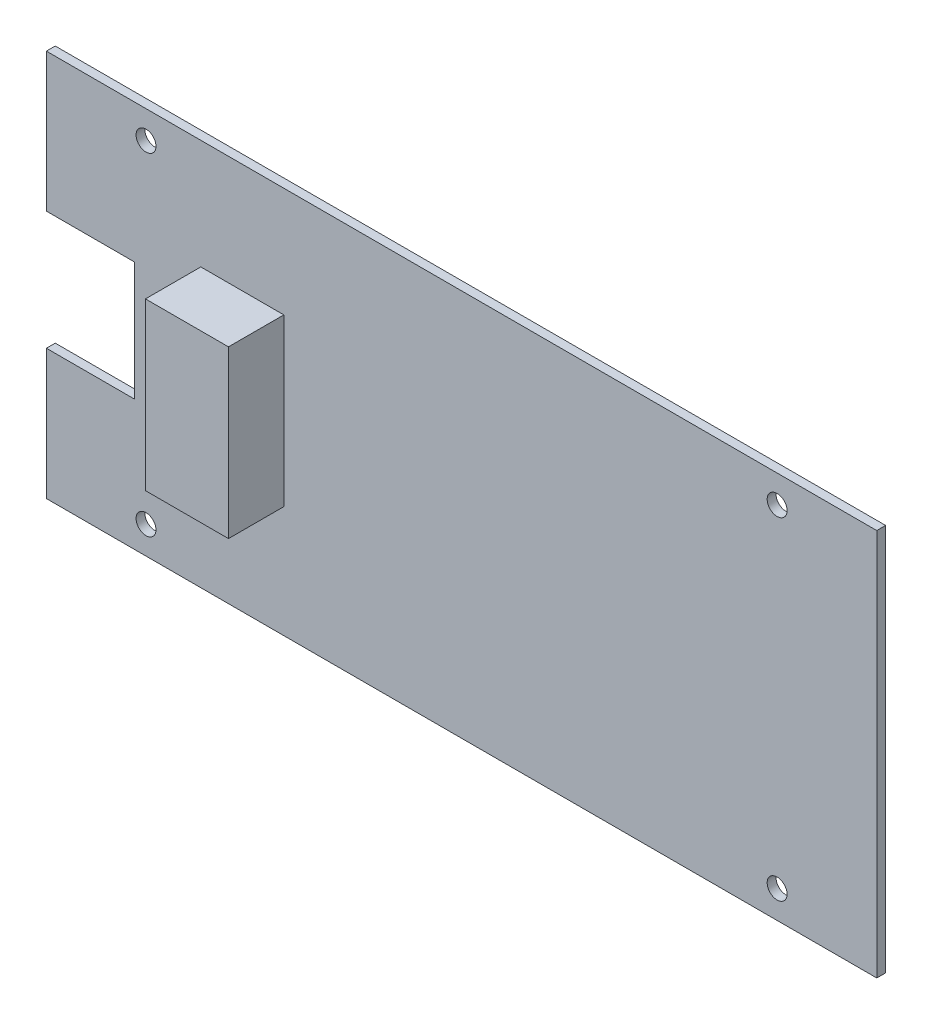
ISO-10303-21;
HEADER;
FILE_DESCRIPTION(('STEP AP214'),'2;1');
FILE_NAME('part.step','',(''),(''),'','','');
FILE_SCHEMA(('AUTOMOTIVE_DESIGN { 1 0 10303 214 1 1 1 1 }'));
ENDSEC;
DATA;
#1=APPLICATION_CONTEXT('core data for automotive mechanical design processes');
#2=APPLICATION_PROTOCOL_DEFINITION('international standard','automotive_design',2000,#1);
#3=PRODUCT_CONTEXT('',#1,'mechanical');
#4=PRODUCT('Part','Part','',(#3));
#5=PRODUCT_RELATED_PRODUCT_CATEGORY('part','',(#4));
#6=PRODUCT_DEFINITION_FORMATION('','',#4);
#7=PRODUCT_DEFINITION_CONTEXT('part definition',#1,'design');
#8=PRODUCT_DEFINITION('design','',#6,#7);
#9=PRODUCT_DEFINITION_SHAPE('','',#8);
#10=(LENGTH_UNIT() NAMED_UNIT(*) SI_UNIT(.MILLI.,.METRE.));
#11=(NAMED_UNIT(*) PLANE_ANGLE_UNIT() SI_UNIT($,.RADIAN.));
#12=(NAMED_UNIT(*) SI_UNIT($,.STERADIAN.) SOLID_ANGLE_UNIT());
#13=UNCERTAINTY_MEASURE_WITH_UNIT(LENGTH_MEASURE(1.E-05),#10,'distance_accuracy_value','');
#14=(GEOMETRIC_REPRESENTATION_CONTEXT(3) GLOBAL_UNCERTAINTY_ASSIGNED_CONTEXT((#13)) GLOBAL_UNIT_ASSIGNED_CONTEXT((#10,
#11,#12)) REPRESENTATION_CONTEXT('',''));
#15=CARTESIAN_POINT('',(0.,0.,0.));
#16=DIRECTION('',(0.,0.,1.));
#17=DIRECTION('',(1.,0.,0.));
#18=AXIS2_PLACEMENT_3D('',#15,#16,#17);
#19=CARTESIAN_POINT('',(0.,0.,1.6));
#20=DIRECTION('',(0.,0.,-1.));
#21=DIRECTION('',(-1.,0.,0.));
#22=AXIS2_PLACEMENT_3D('',#19,#20,#21);
#23=PLANE('',#22);
#24=DIRECTION('',(0.,1.,0.));
#25=VECTOR('',#24,1.);
#26=CARTESIAN_POINT('',(-59.1236109432644,-11.4789722570536,1.6));
#27=LINE('',#26,#25);
#28=CARTESIAN_POINT('',(-59.1236109432644,-11.4789722570536,1.6));
#29=VERTEX_POINT('',#28);
#30=CARTESIAN_POINT('',(-59.1236109432644,9.96957152569356,1.6));
#31=VERTEX_POINT('',#30);
#32=EDGE_CURVE('E145',#29,#31,#27,.T.);
#33=ORIENTED_EDGE('',*,*,#32,.F.);
#34=DIRECTION('',(1.,0.,0.));
#35=VECTOR('',#34,1.);
#36=CARTESIAN_POINT('',(-94.8985125093663,-11.4789722570536,1.6));
#37=LINE('',#36,#35);
#38=CARTESIAN_POINT('',(-75.,-11.4789722570536,1.6));
#39=VERTEX_POINT('',#38);
#40=EDGE_CURVE('E155',#39,#29,#37,.T.);
#41=ORIENTED_EDGE('',*,*,#40,.F.);
#42=DIRECTION('',(0.,-1.,0.));
#43=VECTOR('',#42,1.);
#44=CARTESIAN_POINT('',(-75.,-35.,1.6));
#45=LINE('',#44,#43);
#46=CARTESIAN_POINT('',(-75.,-35.,1.6));
#47=VERTEX_POINT('',#46);
#48=EDGE_CURVE('E199',#39,#47,#45,.T.);
#49=ORIENTED_EDGE('',*,*,#48,.T.);
#50=DIRECTION('',(1.,0.,0.));
#51=VECTOR('',#50,1.);
#52=CARTESIAN_POINT('',(-75.,-35.,1.6));
#53=LINE('',#52,#51);
#54=CARTESIAN_POINT('',(75.,-35.,1.6));
#55=VERTEX_POINT('',#54);
#56=EDGE_CURVE('E203',#47,#55,#53,.T.);
#57=ORIENTED_EDGE('',*,*,#56,.T.);
#58=DIRECTION('',(0.,1.,0.));
#59=VECTOR('',#58,1.);
#60=CARTESIAN_POINT('',(75.,-35.,1.6));
#61=LINE('',#60,#59);
#62=CARTESIAN_POINT('',(75.,35.,1.6));
#63=VERTEX_POINT('',#62);
#64=EDGE_CURVE('E193',#55,#63,#61,.T.);
#65=ORIENTED_EDGE('',*,*,#64,.T.);
#66=DIRECTION('',(-1.,0.,0.));
#67=VECTOR('',#66,1.);
#68=CARTESIAN_POINT('',(-75.,35.,1.6));
#69=LINE('',#68,#67);
#70=CARTESIAN_POINT('',(-75.,35.,1.6));
#71=VERTEX_POINT('',#70);
#72=EDGE_CURVE('E196',#63,#71,#69,.T.);
#73=ORIENTED_EDGE('',*,*,#72,.T.);
#74=CARTESIAN_POINT('',(-75.,9.96957152569356,1.6));
#75=VERTEX_POINT('',#74);
#76=EDGE_CURVE('E200',#71,#75,#45,.T.);
#77=ORIENTED_EDGE('',*,*,#76,.T.);
#78=DIRECTION('',(-1.,0.,0.));
#79=VECTOR('',#78,1.);
#80=CARTESIAN_POINT('',(-94.8985125093663,9.96957152569356,1.6));
#81=LINE('',#80,#79);
#82=EDGE_CURVE('E148',#31,#75,#81,.T.);
#83=ORIENTED_EDGE('',*,*,#82,.F.);
#84=EDGE_LOOP('',(#33,#41,#49,#57,#65,#73,#77,#83));
#85=FACE_BOUND('',#84,.T.);
#86=CARTESIAN_POINT('',(-57.,30.,1.6));
#87=DIRECTION('',(0.,0.,1.));
#88=DIRECTION('',(1.,0.,0.));
#89=AXIS2_PLACEMENT_3D('',#86,#87,#88);
#90=CIRCLE('',#89,1.79999999999999);
#91=CARTESIAN_POINT('',(-55.2,30.,1.6));
#92=VERTEX_POINT('',#91);
#93=EDGE_CURVE('E186',#92,#92,#90,.T.);
#94=ORIENTED_EDGE('',*,*,#93,.F.);
#95=EDGE_LOOP('',(#94));
#96=FACE_BOUND('',#95,.T.);
#97=CARTESIAN_POINT('',(-57.,-30.,1.6));
#98=DIRECTION('',(0.,0.,1.));
#99=DIRECTION('',(1.,0.,0.));
#100=AXIS2_PLACEMENT_3D('',#97,#98,#99);
#101=CIRCLE('',#100,1.79999999999999);
#102=CARTESIAN_POINT('',(-55.2,-30.,1.6));
#103=VERTEX_POINT('',#102);
#104=EDGE_CURVE('E180',#103,#103,#101,.T.);
#105=ORIENTED_EDGE('',*,*,#104,.F.);
#106=EDGE_LOOP('',(#105));
#107=FACE_BOUND('',#106,.T.);
#108=CARTESIAN_POINT('',(57.,-30.,1.6));
#109=DIRECTION('',(0.,0.,1.));
#110=DIRECTION('',(1.,0.,0.));
#111=AXIS2_PLACEMENT_3D('',#108,#109,#110);
#112=CIRCLE('',#111,1.79999999999999);
#113=CARTESIAN_POINT('',(58.8,-30.,1.6));
#114=VERTEX_POINT('',#113);
#115=EDGE_CURVE('E174',#114,#114,#112,.T.);
#116=ORIENTED_EDGE('',*,*,#115,.F.);
#117=EDGE_LOOP('',(#116));
#118=FACE_BOUND('',#117,.T.);
#119=CARTESIAN_POINT('',(57.,30.,1.6));
#120=DIRECTION('',(0.,0.,1.));
#121=DIRECTION('',(1.,0.,0.));
#122=AXIS2_PLACEMENT_3D('',#119,#120,#121);
#123=CIRCLE('',#122,1.79999999999999);
#124=CARTESIAN_POINT('',(58.8,30.,1.6));
#125=VERTEX_POINT('',#124);
#126=EDGE_CURVE('E168',#125,#125,#123,.T.);
#127=ORIENTED_EDGE('',*,*,#126,.F.);
#128=EDGE_LOOP('',(#127));
#129=FACE_BOUND('',#128,.T.);
#130=DIRECTION('',(0.,1.,0.));
#131=VECTOR('',#130,1.);
#132=CARTESIAN_POINT('',(-32.1050944658197,-14.8140158853067,1.6));
#133=LINE('',#132,#131);
#134=CARTESIAN_POINT('',(-32.1050944658197,-14.8140158853067,1.6));
#135=VERTEX_POINT('',#134);
#136=CARTESIAN_POINT('',(-32.1050944658197,15.1859841146933,1.6));
#137=VERTEX_POINT('',#136);
#138=EDGE_CURVE('E144',#135,#137,#133,.T.);
#139=ORIENTED_EDGE('',*,*,#138,.F.);
#140=DIRECTION('',(1.,0.,0.));
#141=VECTOR('',#140,1.);
#142=CARTESIAN_POINT('',(-47.1050944658197,-14.8140158853067,1.6));
#143=LINE('',#142,#141);
#144=CARTESIAN_POINT('',(-47.1050944658197,-14.8140158853067,1.6));
#145=VERTEX_POINT('',#144);
#146=EDGE_CURVE('E141',#145,#135,#143,.T.);
#147=ORIENTED_EDGE('',*,*,#146,.F.);
#148=DIRECTION('',(0.,-1.,0.));
#149=VECTOR('',#148,1.);
#150=CARTESIAN_POINT('',(-47.1050944658197,-14.8140158853067,1.6));
#151=LINE('',#150,#149);
#152=CARTESIAN_POINT('',(-47.1050944658197,15.1859841146933,1.6));
#153=VERTEX_POINT('',#152);
#154=EDGE_CURVE('E56',#153,#145,#151,.T.);
#155=ORIENTED_EDGE('',*,*,#154,.F.);
#156=DIRECTION('',(-1.,0.,0.));
#157=VECTOR('',#156,1.);
#158=CARTESIAN_POINT('',(-47.1050944658197,15.1859841146933,1.6));
#159=LINE('',#158,#157);
#160=EDGE_CURVE('E51',#137,#153,#159,.T.);
#161=ORIENTED_EDGE('',*,*,#160,.F.);
#162=EDGE_LOOP('',(#139,#147,#155,#161));
#163=FACE_BOUND('',#162,.T.);
#164=ADVANCED_FACE('F36',(#85,#96,#107,#118,#129,#163),#23,.F.);
#165=CARTESIAN_POINT('',(-75.,-35.,1.6));
#166=DIRECTION('',(1.,0.,0.));
#167=DIRECTION('',(0.,0.,-1.));
#168=AXIS2_PLACEMENT_3D('',#165,#166,#167);
#169=PLANE('',#168);
#170=ORIENTED_EDGE('',*,*,#48,.F.);
#171=DIRECTION('',(0.,0.,-1.));
#172=VECTOR('',#171,1.);
#173=CARTESIAN_POINT('',(-75.,-11.4789722570536,1.6));
#174=LINE('',#173,#172);
#175=CARTESIAN_POINT('',(-75.,-11.4789722570536,0.));
#176=VERTEX_POINT('',#175);
#177=EDGE_CURVE('E165',#39,#176,#174,.T.);
#178=ORIENTED_EDGE('',*,*,#177,.T.);
#179=DIRECTION('',(0.,-1.,0.));
#180=VECTOR('',#179,1.);
#181=CARTESIAN_POINT('',(-75.,-35.,0.));
#182=LINE('',#181,#180);
#183=CARTESIAN_POINT('',(-75.,-35.,0.));
#184=VERTEX_POINT('',#183);
#185=EDGE_CURVE('E210',#176,#184,#182,.T.);
#186=ORIENTED_EDGE('',*,*,#185,.T.);
#187=DIRECTION('',(0.,0.,-1.));
#188=VECTOR('',#187,1.);
#189=CARTESIAN_POINT('',(-75.,-35.,1.6));
#190=LINE('',#189,#188);
#191=EDGE_CURVE('E217',#47,#184,#190,.T.);
#192=ORIENTED_EDGE('',*,*,#191,.F.);
#193=EDGE_LOOP('',(#170,#178,#186,#192));
#194=FACE_BOUND('',#193,.T.);
#195=ADVANCED_FACE('F247',(#194),#169,.F.);
#196=CARTESIAN_POINT('',(75.,-35.,1.6));
#197=DIRECTION('',(-1.,0.,0.));
#198=DIRECTION('',(0.,0.,1.));
#199=AXIS2_PLACEMENT_3D('',#196,#197,#198);
#200=PLANE('',#199);
#201=DIRECTION('',(0.,1.,0.));
#202=VECTOR('',#201,1.);
#203=CARTESIAN_POINT('',(75.,-35.,0.));
#204=LINE('',#203,#202);
#205=CARTESIAN_POINT('',(75.,-35.,0.));
#206=VERTEX_POINT('',#205);
#207=CARTESIAN_POINT('',(75.,35.,0.));
#208=VERTEX_POINT('',#207);
#209=EDGE_CURVE('E192',#206,#208,#204,.T.);
#210=ORIENTED_EDGE('',*,*,#209,.T.);
#211=DIRECTION('',(0.,0.,-1.));
#212=VECTOR('',#211,1.);
#213=CARTESIAN_POINT('',(75.,35.,1.6));
#214=LINE('',#213,#212);
#215=EDGE_CURVE('E223',#63,#208,#214,.T.);
#216=ORIENTED_EDGE('',*,*,#215,.F.);
#217=ORIENTED_EDGE('',*,*,#64,.F.);
#218=DIRECTION('',(0.,0.,-1.));
#219=VECTOR('',#218,1.);
#220=CARTESIAN_POINT('',(75.,-35.,1.6));
#221=LINE('',#220,#219);
#222=EDGE_CURVE('E205',#55,#206,#221,.T.);
#223=ORIENTED_EDGE('',*,*,#222,.T.);
#224=EDGE_LOOP('',(#210,#216,#217,#223));
#225=FACE_BOUND('',#224,.T.);
#226=ADVANCED_FACE('F38',(#225),#200,.F.);
#227=CARTESIAN_POINT('',(-75.,35.,1.6));
#228=DIRECTION('',(0.,-1.,0.));
#229=DIRECTION('',(0.,0.,-1.));
#230=AXIS2_PLACEMENT_3D('',#227,#228,#229);
#231=PLANE('',#230);
#232=DIRECTION('',(-1.,0.,0.));
#233=VECTOR('',#232,1.);
#234=CARTESIAN_POINT('',(-75.,35.,0.));
#235=LINE('',#234,#233);
#236=CARTESIAN_POINT('',(-75.,35.,0.));
#237=VERTEX_POINT('',#236);
#238=EDGE_CURVE('E208',#208,#237,#235,.T.);
#239=ORIENTED_EDGE('',*,*,#238,.T.);
#240=DIRECTION('',(0.,0.,-1.));
#241=VECTOR('',#240,1.);
#242=CARTESIAN_POINT('',(-75.,35.,1.6));
#243=LINE('',#242,#241);
#244=EDGE_CURVE('E220',#71,#237,#243,.T.);
#245=ORIENTED_EDGE('',*,*,#244,.F.);
#246=ORIENTED_EDGE('',*,*,#72,.F.);
#247=ORIENTED_EDGE('',*,*,#215,.T.);
#248=EDGE_LOOP('',(#239,#245,#246,#247));
#249=FACE_BOUND('',#248,.T.);
#250=ADVANCED_FACE('F265',(#249),#231,.F.);
#251=CARTESIAN_POINT('',(-75.,9.96957152569355,0.));
#252=VERTEX_POINT('',#251);
#253=EDGE_CURVE('E211',#237,#252,#182,.T.);
#254=ORIENTED_EDGE('',*,*,#253,.T.);
#255=DIRECTION('',(0.,0.,1.));
#256=VECTOR('',#255,1.);
#257=CARTESIAN_POINT('',(-75.,9.96957152569355,1.6));
#258=LINE('',#257,#256);
#259=EDGE_CURVE('E161',#252,#75,#258,.T.);
#260=ORIENTED_EDGE('',*,*,#259,.T.);
#261=ORIENTED_EDGE('',*,*,#76,.F.);
#262=ORIENTED_EDGE('',*,*,#244,.T.);
#263=EDGE_LOOP('',(#254,#260,#261,#262));
#264=FACE_BOUND('',#263,.T.);
#265=ADVANCED_FACE('F261',(#264),#169,.F.);
#266=CARTESIAN_POINT('',(-75.,-35.,1.6));
#267=DIRECTION('',(0.,1.,0.));
#268=DIRECTION('',(0.,0.,1.));
#269=AXIS2_PLACEMENT_3D('',#266,#267,#268);
#270=PLANE('',#269);
#271=DIRECTION('',(1.,0.,0.));
#272=VECTOR('',#271,1.);
#273=CARTESIAN_POINT('',(-75.,-35.,0.));
#274=LINE('',#273,#272);
#275=EDGE_CURVE('E197',#184,#206,#274,.T.);
#276=ORIENTED_EDGE('',*,*,#275,.T.);
#277=ORIENTED_EDGE('',*,*,#222,.F.);
#278=ORIENTED_EDGE('',*,*,#56,.F.);
#279=ORIENTED_EDGE('',*,*,#191,.T.);
#280=EDGE_LOOP('',(#276,#277,#278,#279));
#281=FACE_BOUND('',#280,.T.);
#282=ADVANCED_FACE('F250',(#281),#270,.F.);
#283=CARTESIAN_POINT('',(0.,0.,0.));
#284=DIRECTION('',(0.,0.,-1.));
#285=DIRECTION('',(-1.,0.,0.));
#286=AXIS2_PLACEMENT_3D('',#283,#284,#285);
#287=PLANE('',#286);
#288=DIRECTION('',(-1.,0.,0.));
#289=VECTOR('',#288,1.);
#290=CARTESIAN_POINT('',(0.,-11.4789722570536,0.));
#291=LINE('',#290,#289);
#292=CARTESIAN_POINT('',(-59.1236109432644,-11.4789722570536,0.));
#293=VERTEX_POINT('',#292);
#294=EDGE_CURVE('E11',#293,#176,#291,.T.);
#295=ORIENTED_EDGE('',*,*,#294,.F.);
#296=DIRECTION('',(0.,-1.,0.));
#297=VECTOR('',#296,1.);
#298=CARTESIAN_POINT('',(-59.1236109432644,0.,0.));
#299=LINE('',#298,#297);
#300=CARTESIAN_POINT('',(-59.1236109432644,9.96957152569356,0.));
#301=VERTEX_POINT('',#300);
#302=EDGE_CURVE('E44',#301,#293,#299,.T.);
#303=ORIENTED_EDGE('',*,*,#302,.F.);
#304=DIRECTION('',(1.,0.,0.));
#305=VECTOR('',#304,1.);
#306=CARTESIAN_POINT('',(0.,9.96957152569356,0.));
#307=LINE('',#306,#305);
#308=EDGE_CURVE('E226',#252,#301,#307,.T.);
#309=ORIENTED_EDGE('',*,*,#308,.F.);
#310=ORIENTED_EDGE('',*,*,#253,.F.);
#311=ORIENTED_EDGE('',*,*,#238,.F.);
#312=ORIENTED_EDGE('',*,*,#209,.F.);
#313=ORIENTED_EDGE('',*,*,#275,.F.);
#314=ORIENTED_EDGE('',*,*,#185,.F.);
#315=EDGE_LOOP('',(#295,#303,#309,#310,#311,#312,#313,#314));
#316=FACE_BOUND('',#315,.T.);
#317=CARTESIAN_POINT('',(57.,30.,0.));
#318=DIRECTION('',(0.,0.,1.));
#319=DIRECTION('',(1.,0.,0.));
#320=AXIS2_PLACEMENT_3D('',#317,#318,#319);
#321=CIRCLE('',#320,1.8);
#322=CARTESIAN_POINT('',(58.8,30.,0.));
#323=VERTEX_POINT('',#322);
#324=EDGE_CURVE('E171',#323,#323,#321,.T.);
#325=ORIENTED_EDGE('',*,*,#324,.T.);
#326=EDGE_LOOP('',(#325));
#327=FACE_BOUND('',#326,.T.);
#328=CARTESIAN_POINT('',(57.,-30.,0.));
#329=DIRECTION('',(0.,0.,1.));
#330=DIRECTION('',(1.,0.,0.));
#331=AXIS2_PLACEMENT_3D('',#328,#329,#330);
#332=CIRCLE('',#331,1.8);
#333=CARTESIAN_POINT('',(58.8,-30.,0.));
#334=VERTEX_POINT('',#333);
#335=EDGE_CURVE('E177',#334,#334,#332,.T.);
#336=ORIENTED_EDGE('',*,*,#335,.T.);
#337=EDGE_LOOP('',(#336));
#338=FACE_BOUND('',#337,.T.);
#339=CARTESIAN_POINT('',(-57.,-30.,0.));
#340=DIRECTION('',(0.,0.,1.));
#341=DIRECTION('',(1.,0.,0.));
#342=AXIS2_PLACEMENT_3D('',#339,#340,#341);
#343=CIRCLE('',#342,1.8);
#344=CARTESIAN_POINT('',(-55.2,-30.,0.));
#345=VERTEX_POINT('',#344);
#346=EDGE_CURVE('E183',#345,#345,#343,.T.);
#347=ORIENTED_EDGE('',*,*,#346,.T.);
#348=EDGE_LOOP('',(#347));
#349=FACE_BOUND('',#348,.T.);
#350=CARTESIAN_POINT('',(-57.,30.,0.));
#351=DIRECTION('',(0.,0.,1.));
#352=DIRECTION('',(1.,0.,0.));
#353=AXIS2_PLACEMENT_3D('',#350,#351,#352);
#354=CIRCLE('',#353,1.8);
#355=CARTESIAN_POINT('',(-55.2,30.,0.));
#356=VERTEX_POINT('',#355);
#357=EDGE_CURVE('E189',#356,#356,#354,.T.);
#358=ORIENTED_EDGE('',*,*,#357,.T.);
#359=EDGE_LOOP('',(#358));
#360=FACE_BOUND('',#359,.T.);
#361=ADVANCED_FACE('F240',(#316,#327,#338,#349,#360),#287,.T.);
#362=CARTESIAN_POINT('',(-57.,30.,1.6));
#363=DIRECTION('',(0.,0.,1.));
#364=DIRECTION('',(1.,0.,0.));
#365=AXIS2_PLACEMENT_3D('',#362,#363,#364);
#366=CYLINDRICAL_SURFACE('',#365,1.79999999999999);
#367=ORIENTED_EDGE('',*,*,#357,.F.);
#368=EDGE_LOOP('',(#367));
#369=FACE_BOUND('',#368,.T.);
#370=ORIENTED_EDGE('',*,*,#93,.T.);
#371=EDGE_LOOP('',(#370));
#372=FACE_BOUND('',#371,.T.);
#373=ADVANCED_FACE('F279',(#369,#372),#366,.F.);
#374=CARTESIAN_POINT('',(-57.,-30.,1.6));
#375=DIRECTION('',(0.,0.,1.));
#376=DIRECTION('',(1.,0.,0.));
#377=AXIS2_PLACEMENT_3D('',#374,#375,#376);
#378=CYLINDRICAL_SURFACE('',#377,1.79999999999999);
#379=ORIENTED_EDGE('',*,*,#346,.F.);
#380=EDGE_LOOP('',(#379));
#381=FACE_BOUND('',#380,.T.);
#382=ORIENTED_EDGE('',*,*,#104,.T.);
#383=EDGE_LOOP('',(#382));
#384=FACE_BOUND('',#383,.T.);
#385=ADVANCED_FACE('F305',(#381,#384),#378,.F.);
#386=CARTESIAN_POINT('',(57.,-30.,1.6));
#387=DIRECTION('',(0.,0.,1.));
#388=DIRECTION('',(1.,0.,0.));
#389=AXIS2_PLACEMENT_3D('',#386,#387,#388);
#390=CYLINDRICAL_SURFACE('',#389,1.79999999999999);
#391=ORIENTED_EDGE('',*,*,#335,.F.);
#392=EDGE_LOOP('',(#391));
#393=FACE_BOUND('',#392,.T.);
#394=ORIENTED_EDGE('',*,*,#115,.T.);
#395=EDGE_LOOP('',(#394));
#396=FACE_BOUND('',#395,.T.);
#397=ADVANCED_FACE('F312',(#393,#396),#390,.F.);
#398=CARTESIAN_POINT('',(57.,30.,1.6));
#399=DIRECTION('',(0.,0.,1.));
#400=DIRECTION('',(1.,0.,0.));
#401=AXIS2_PLACEMENT_3D('',#398,#399,#400);
#402=CYLINDRICAL_SURFACE('',#401,1.79999999999999);
#403=ORIENTED_EDGE('',*,*,#324,.F.);
#404=EDGE_LOOP('',(#403));
#405=FACE_BOUND('',#404,.T.);
#406=ORIENTED_EDGE('',*,*,#126,.T.);
#407=EDGE_LOOP('',(#406));
#408=FACE_BOUND('',#407,.T.);
#409=ADVANCED_FACE('F319',(#405,#408),#402,.F.);
#410=CARTESIAN_POINT('',(-94.8985125093663,-11.4789722570536,-8.4));
#411=DIRECTION('',(0.,-1.,0.));
#412=DIRECTION('',(0.,0.,-1.));
#413=AXIS2_PLACEMENT_3D('',#410,#411,#412);
#414=PLANE('',#413);
#415=ORIENTED_EDGE('',*,*,#40,.T.);
#416=DIRECTION('',(0.,0.,1.));
#417=VECTOR('',#416,1.);
#418=CARTESIAN_POINT('',(-59.1236109432644,-11.4789722570536,-8.4));
#419=LINE('',#418,#417);
#420=EDGE_CURVE('E159',#293,#29,#419,.T.);
#421=ORIENTED_EDGE('',*,*,#420,.F.);
#422=ORIENTED_EDGE('',*,*,#294,.T.);
#423=ORIENTED_EDGE('',*,*,#177,.F.);
#424=EDGE_LOOP('',(#415,#421,#422,#423));
#425=FACE_BOUND('',#424,.T.);
#426=ADVANCED_FACE('F236',(#425),#414,.F.);
#427=CARTESIAN_POINT('',(-94.8985125093663,9.96957152569356,-8.4));
#428=DIRECTION('',(0.,1.,0.));
#429=DIRECTION('',(0.,0.,1.));
#430=AXIS2_PLACEMENT_3D('',#427,#428,#429);
#431=PLANE('',#430);
#432=ORIENTED_EDGE('',*,*,#308,.T.);
#433=DIRECTION('',(0.,0.,1.));
#434=VECTOR('',#433,1.);
#435=CARTESIAN_POINT('',(-59.1236109432644,9.96957152569356,-8.4));
#436=LINE('',#435,#434);
#437=EDGE_CURVE('E158',#301,#31,#436,.T.);
#438=ORIENTED_EDGE('',*,*,#437,.T.);
#439=ORIENTED_EDGE('',*,*,#82,.T.);
#440=ORIENTED_EDGE('',*,*,#259,.F.);
#441=EDGE_LOOP('',(#432,#438,#439,#440));
#442=FACE_BOUND('',#441,.T.);
#443=ADVANCED_FACE('F259',(#442),#431,.F.);
#444=CARTESIAN_POINT('',(-59.1236109432644,-11.4789722570536,-8.4));
#445=DIRECTION('',(1.,0.,0.));
#446=DIRECTION('',(0.,0.,-1.));
#447=AXIS2_PLACEMENT_3D('',#444,#445,#446);
#448=PLANE('',#447);
#449=ORIENTED_EDGE('',*,*,#302,.T.);
#450=ORIENTED_EDGE('',*,*,#420,.T.);
#451=ORIENTED_EDGE('',*,*,#32,.T.);
#452=ORIENTED_EDGE('',*,*,#437,.F.);
#453=EDGE_LOOP('',(#449,#450,#451,#452));
#454=FACE_BOUND('',#453,.T.);
#455=ADVANCED_FACE('F231',(#454),#448,.F.);
#456=CARTESIAN_POINT('',(-32.1050944658197,-14.8140158853067,11.6));
#457=DIRECTION('',(-1.,0.,0.));
#458=DIRECTION('',(0.,0.,1.));
#459=AXIS2_PLACEMENT_3D('',#456,#457,#458);
#460=PLANE('',#459);
#461=ORIENTED_EDGE('',*,*,#138,.T.);
#462=DIRECTION('',(0.,0.,-1.));
#463=VECTOR('',#462,1.);
#464=CARTESIAN_POINT('',(-32.1050944658197,15.1859841146933,11.6));
#465=LINE('',#464,#463);
#466=CARTESIAN_POINT('',(-32.1050944658197,15.1859841146933,11.6));
#467=VERTEX_POINT('',#466);
#468=EDGE_CURVE('E125',#467,#137,#465,.T.);
#469=ORIENTED_EDGE('',*,*,#468,.F.);
#470=DIRECTION('',(0.,1.,0.));
#471=VECTOR('',#470,1.);
#472=CARTESIAN_POINT('',(-32.1050944658197,-14.8140158853067,11.6));
#473=LINE('',#472,#471);
#474=CARTESIAN_POINT('',(-32.1050944658197,-14.8140158853067,11.6));
#475=VERTEX_POINT('',#474);
#476=EDGE_CURVE('E132',#475,#467,#473,.T.);
#477=ORIENTED_EDGE('',*,*,#476,.F.);
#478=DIRECTION('',(0.,0.,-1.));
#479=VECTOR('',#478,1.);
#480=CARTESIAN_POINT('',(-32.1050944658197,-14.8140158853067,11.6));
#481=LINE('',#480,#479);
#482=EDGE_CURVE('E430',#475,#135,#481,.T.);
#483=ORIENTED_EDGE('',*,*,#482,.T.);
#484=EDGE_LOOP('',(#461,#469,#477,#483));
#485=FACE_BOUND('',#484,.T.);
#486=ADVANCED_FACE('F143',(#485),#460,.F.);
#487=CARTESIAN_POINT('',(-47.1050944658197,15.1859841146933,11.6));
#488=DIRECTION('',(0.,-1.,0.));
#489=DIRECTION('',(0.,0.,-1.));
#490=AXIS2_PLACEMENT_3D('',#487,#488,#489);
#491=PLANE('',#490);
#492=ORIENTED_EDGE('',*,*,#160,.T.);
#493=DIRECTION('',(0.,0.,-1.));
#494=VECTOR('',#493,1.);
#495=CARTESIAN_POINT('',(-47.1050944658197,15.1859841146933,11.6));
#496=LINE('',#495,#494);
#497=CARTESIAN_POINT('',(-47.1050944658197,15.1859841146933,11.6));
#498=VERTEX_POINT('',#497);
#499=EDGE_CURVE('E128',#498,#153,#496,.T.);
#500=ORIENTED_EDGE('',*,*,#499,.F.);
#501=DIRECTION('',(-1.,0.,0.));
#502=VECTOR('',#501,1.);
#503=CARTESIAN_POINT('',(-47.1050944658197,15.1859841146933,11.6));
#504=LINE('',#503,#502);
#505=EDGE_CURVE('E121',#467,#498,#504,.T.);
#506=ORIENTED_EDGE('',*,*,#505,.F.);
#507=ORIENTED_EDGE('',*,*,#468,.T.);
#508=EDGE_LOOP('',(#492,#500,#506,#507));
#509=FACE_BOUND('',#508,.T.);
#510=ADVANCED_FACE('F123',(#509),#491,.F.);
#511=CARTESIAN_POINT('',(-47.1050944658197,-14.8140158853067,11.6));
#512=DIRECTION('',(1.,0.,0.));
#513=DIRECTION('',(0.,0.,-1.));
#514=AXIS2_PLACEMENT_3D('',#511,#512,#513);
#515=PLANE('',#514);
#516=ORIENTED_EDGE('',*,*,#154,.T.);
#517=DIRECTION('',(0.,0.,-1.));
#518=VECTOR('',#517,1.);
#519=CARTESIAN_POINT('',(-47.1050944658197,-14.8140158853067,11.6));
#520=LINE('',#519,#518);
#521=CARTESIAN_POINT('',(-47.1050944658197,-14.8140158853067,11.6));
#522=VERTEX_POINT('',#521);
#523=EDGE_CURVE('E150',#522,#145,#520,.T.);
#524=ORIENTED_EDGE('',*,*,#523,.F.);
#525=DIRECTION('',(0.,-1.,0.));
#526=VECTOR('',#525,1.);
#527=CARTESIAN_POINT('',(-47.1050944658197,-14.8140158853067,11.6));
#528=LINE('',#527,#526);
#529=EDGE_CURVE('E131',#498,#522,#528,.T.);
#530=ORIENTED_EDGE('',*,*,#529,.F.);
#531=ORIENTED_EDGE('',*,*,#499,.T.);
#532=EDGE_LOOP('',(#516,#524,#530,#531));
#533=FACE_BOUND('',#532,.T.);
#534=ADVANCED_FACE('F357',(#533),#515,.F.);
#535=CARTESIAN_POINT('',(-47.1050944658197,-14.8140158853067,11.6));
#536=DIRECTION('',(0.,1.,0.));
#537=DIRECTION('',(0.,0.,1.));
#538=AXIS2_PLACEMENT_3D('',#535,#536,#537);
#539=PLANE('',#538);
#540=ORIENTED_EDGE('',*,*,#146,.T.);
#541=ORIENTED_EDGE('',*,*,#482,.F.);
#542=DIRECTION('',(1.,0.,0.));
#543=VECTOR('',#542,1.);
#544=CARTESIAN_POINT('',(-47.1050944658197,-14.8140158853067,11.6));
#545=LINE('',#544,#543);
#546=EDGE_CURVE('E137',#522,#475,#545,.T.);
#547=ORIENTED_EDGE('',*,*,#546,.F.);
#548=ORIENTED_EDGE('',*,*,#523,.T.);
#549=EDGE_LOOP('',(#540,#541,#547,#548));
#550=FACE_BOUND('',#549,.T.);
#551=ADVANCED_FACE('F364',(#550),#539,.F.);
#552=CARTESIAN_POINT('',(0.,0.,11.6));
#553=DIRECTION('',(0.,0.,-1.));
#554=DIRECTION('',(-1.,0.,0.));
#555=AXIS2_PLACEMENT_3D('',#552,#553,#554);
#556=PLANE('',#555);
#557=ORIENTED_EDGE('',*,*,#476,.T.);
#558=ORIENTED_EDGE('',*,*,#505,.T.);
#559=ORIENTED_EDGE('',*,*,#529,.T.);
#560=ORIENTED_EDGE('',*,*,#546,.T.);
#561=EDGE_LOOP('',(#557,#558,#559,#560));
#562=FACE_BOUND('',#561,.T.);
#563=ADVANCED_FACE('F135',(#562),#556,.F.);
#564=CLOSED_SHELL('',(#164,#195,#226,#250,#265,#282,#361,#373,#385,#397,#409,#426,#443,#455,
#486,#510,#534,#551,#563));
#565=MANIFOLD_SOLID_BREP('B2',#564);
#566=ADVANCED_BREP_SHAPE_REPRESENTATION('',(#18,#565),#14);
#567=SHAPE_DEFINITION_REPRESENTATION(#9,#566);
ENDSEC;
END-ISO-10303-21;
